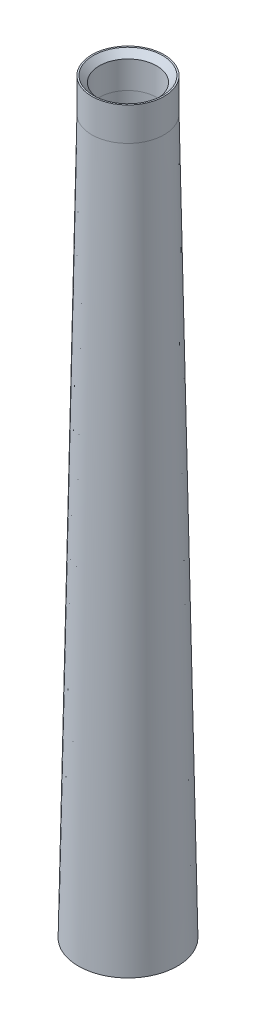
ISO-10303-21;
HEADER;
FILE_DESCRIPTION(('STEP AP214'),'2;1');
FILE_NAME('part.step','',(''),(''),'','','');
FILE_SCHEMA(('AUTOMOTIVE_DESIGN { 1 0 10303 214 1 1 1 1 }'));
ENDSEC;
DATA;
#1=APPLICATION_CONTEXT('core data for automotive mechanical design processes');
#2=APPLICATION_PROTOCOL_DEFINITION('international standard','automotive_design',2000,#1);
#3=PRODUCT_CONTEXT('',#1,'mechanical');
#4=PRODUCT('Part','Part','',(#3));
#5=PRODUCT_RELATED_PRODUCT_CATEGORY('part','',(#4));
#6=PRODUCT_DEFINITION_FORMATION('','',#4);
#7=PRODUCT_DEFINITION_CONTEXT('part definition',#1,'design');
#8=PRODUCT_DEFINITION('design','',#6,#7);
#9=PRODUCT_DEFINITION_SHAPE('','',#8);
#10=(LENGTH_UNIT() NAMED_UNIT(*) SI_UNIT(.MILLI.,.METRE.));
#11=(NAMED_UNIT(*) PLANE_ANGLE_UNIT() SI_UNIT($,.RADIAN.));
#12=(NAMED_UNIT(*) SI_UNIT($,.STERADIAN.) SOLID_ANGLE_UNIT());
#13=UNCERTAINTY_MEASURE_WITH_UNIT(LENGTH_MEASURE(1.E-05),#10,'distance_accuracy_value','');
#14=(GEOMETRIC_REPRESENTATION_CONTEXT(3) GLOBAL_UNCERTAINTY_ASSIGNED_CONTEXT((#13)) GLOBAL_UNIT_ASSIGNED_CONTEXT((#10,
#11,#12)) REPRESENTATION_CONTEXT('',''));
#15=CARTESIAN_POINT('',(0.,0.,0.));
#16=DIRECTION('',(0.,0.,1.));
#17=DIRECTION('',(1.,0.,0.));
#18=AXIS2_PLACEMENT_3D('',#15,#16,#17);
#19=CARTESIAN_POINT('',(0.,0.,0.));
#20=DIRECTION('',(0.,-1.,0.));
#21=DIRECTION('',(0.,0.,-1.));
#22=AXIS2_PLACEMENT_3D('',#19,#20,#21);
#23=PLANE('',#22);
#24=CARTESIAN_POINT('',(0.,0.,0.));
#25=DIRECTION('',(0.,1.,0.));
#26=DIRECTION('',(0.,0.,1.));
#27=AXIS2_PLACEMENT_3D('',#24,#25,#26);
#28=CIRCLE('',#27,8.98497221042653);
#29=CARTESIAN_POINT('',(0.,0.,8.98497221042653));
#30=VERTEX_POINT('',#29);
#31=EDGE_CURVE('E50',#30,#30,#28,.T.);
#32=ORIENTED_EDGE('',*,*,#31,.T.);
#33=EDGE_LOOP('',(#32));
#34=FACE_BOUND('',#33,.T.);
#35=CARTESIAN_POINT('',(0.,0.,0.));
#36=DIRECTION('',(0.,1.,0.));
#37=DIRECTION('',(0.,0.,1.));
#38=AXIS2_PLACEMENT_3D('',#35,#36,#37);
#39=CIRCLE('',#38,10.57275);
#40=CARTESIAN_POINT('',(0.,0.,10.57275));
#41=VERTEX_POINT('',#40);
#42=EDGE_CURVE('E41',#41,#41,#39,.T.);
#43=ORIENTED_EDGE('',*,*,#42,.F.);
#44=EDGE_LOOP('',(#43));
#45=FACE_BOUND('',#44,.T.);
#46=ADVANCED_FACE('F30',(#34,#45),#23,.T.);
#47=CARTESIAN_POINT('',(0.,152.4,0.));
#48=DIRECTION('',(0.,-1.,0.));
#49=DIRECTION('',(0.,0.,-1.));
#50=AXIS2_PLACEMENT_3D('',#47,#48,#49);
#51=CONICAL_SURFACE('',#50,7.72160000000001,0.0187061511418619);
#52=ORIENTED_EDGE('',*,*,#42,.T.);
#53=EDGE_LOOP('',(#52));
#54=FACE_BOUND('',#53,.T.);
#55=CARTESIAN_POINT('',(0.,152.4,0.));
#56=DIRECTION('',(0.,1.,0.));
#57=DIRECTION('',(0.,0.,1.));
#58=AXIS2_PLACEMENT_3D('',#55,#56,#57);
#59=CIRCLE('',#58,7.72160000000001);
#60=CARTESIAN_POINT('',(0.,152.4,7.7216));
#61=VERTEX_POINT('',#60);
#62=EDGE_CURVE('E45',#61,#61,#59,.T.);
#63=ORIENTED_EDGE('',*,*,#62,.F.);
#64=EDGE_LOOP('',(#63));
#65=FACE_BOUND('',#64,.T.);
#66=ADVANCED_FACE('F76',(#54,#65),#51,.T.);
#67=CARTESIAN_POINT('',(0.,152.4,0.));
#68=DIRECTION('',(0.,-1.,0.));
#69=DIRECTION('',(0.,0.,-1.));
#70=AXIS2_PLACEMENT_3D('',#67,#68,#69);
#71=CONICAL_SURFACE('',#70,6.13382221042654,0.0187061511418619);
#72=ORIENTED_EDGE('',*,*,#31,.F.);
#73=EDGE_LOOP('',(#72));
#74=FACE_BOUND('',#73,.T.);
#75=CARTESIAN_POINT('',(0.,152.4,0.));
#76=DIRECTION('',(0.,1.,0.));
#77=DIRECTION('',(0.,0.,1.));
#78=AXIS2_PLACEMENT_3D('',#75,#76,#77);
#79=CIRCLE('',#78,6.13382221042654);
#80=CARTESIAN_POINT('',(0.,152.4,6.13382221042653));
#81=VERTEX_POINT('',#80);
#82=EDGE_CURVE('E56',#81,#81,#79,.T.);
#83=ORIENTED_EDGE('',*,*,#82,.T.);
#84=EDGE_LOOP('',(#83));
#85=FACE_BOUND('',#84,.T.);
#86=ADVANCED_FACE('F60',(#74,#85),#71,.F.);
#87=CARTESIAN_POINT('',(0.,159.512,0.));
#88=DIRECTION('',(0.,1.,0.));
#89=DIRECTION('',(0.,0.,1.));
#90=AXIS2_PLACEMENT_3D('',#87,#88,#89);
#91=PLANE('',#90);
#92=CARTESIAN_POINT('',(0.,159.512,0.));
#93=DIRECTION('',(0.,1.,0.));
#94=DIRECTION('',(0.,0.,1.));
#95=AXIS2_PLACEMENT_3D('',#92,#93,#94);
#96=CIRCLE('',#95,7.40382221042658);
#97=CARTESIAN_POINT('',(0.,159.512,7.40382221042657));
#98=VERTEX_POINT('',#97);
#99=EDGE_CURVE('E10',#98,#98,#96,.F.);
#100=ORIENTED_EDGE('',*,*,#99,.T.);
#101=EDGE_LOOP('',(#100));
#102=FACE_BOUND('',#101,.T.);
#103=CARTESIAN_POINT('',(0.,159.512,0.));
#104=DIRECTION('',(0.,1.,0.));
#105=DIRECTION('',(0.,0.,1.));
#106=AXIS2_PLACEMENT_3D('',#103,#104,#105);
#107=CIRCLE('',#106,7.72160000000001);
#108=CARTESIAN_POINT('',(0.,159.512,7.7216));
#109=VERTEX_POINT('',#108);
#110=EDGE_CURVE('E53',#109,#109,#107,.T.);
#111=ORIENTED_EDGE('',*,*,#110,.T.);
#112=EDGE_LOOP('',(#111));
#113=FACE_BOUND('',#112,.T.);
#114=ADVANCED_FACE('F71',(#102,#113),#91,.T.);
#115=CARTESIAN_POINT('',(0.,159.512,0.));
#116=DIRECTION('',(0.,-1.,0.));
#117=DIRECTION('',(0.,0.,-1.));
#118=AXIS2_PLACEMENT_3D('',#115,#116,#117);
#119=CYLINDRICAL_SURFACE('',#118,7.72160000000001);
#120=ORIENTED_EDGE('',*,*,#110,.F.);
#121=EDGE_LOOP('',(#120));
#122=FACE_BOUND('',#121,.T.);
#123=ORIENTED_EDGE('',*,*,#62,.T.);
#124=EDGE_LOOP('',(#123));
#125=FACE_BOUND('',#124,.T.);
#126=ADVANCED_FACE('F64',(#122,#125),#119,.T.);
#127=CARTESIAN_POINT('',(0.,159.512,0.));
#128=DIRECTION('',(0.,-1.,0.));
#129=DIRECTION('',(0.,0.,-1.));
#130=AXIS2_PLACEMENT_3D('',#127,#128,#129);
#131=CYLINDRICAL_SURFACE('',#130,6.13382221042654);
#132=CARTESIAN_POINT('',(0.,158.242,0.));
#133=DIRECTION('',(0.,1.,0.));
#134=DIRECTION('',(0.,0.,1.));
#135=AXIS2_PLACEMENT_3D('',#132,#133,#134);
#136=CIRCLE('',#135,6.13382221042654);
#137=CARTESIAN_POINT('',(0.,158.242,6.13382221042653));
#138=VERTEX_POINT('',#137);
#139=EDGE_CURVE('E37',#138,#138,#136,.T.);
#140=ORIENTED_EDGE('',*,*,#139,.T.);
#141=EDGE_LOOP('',(#140));
#142=FACE_BOUND('',#141,.T.);
#143=ORIENTED_EDGE('',*,*,#82,.F.);
#144=EDGE_LOOP('',(#143));
#145=FACE_BOUND('',#144,.T.);
#146=ADVANCED_FACE('F62',(#142,#145),#131,.F.);
#147=CARTESIAN_POINT('',(0.,158.242,0.));
#148=DIRECTION('',(0.,1.,0.));
#149=DIRECTION('',(0.,0.,1.));
#150=AXIS2_PLACEMENT_3D('',#147,#148,#149);
#151=CONICAL_SURFACE('',#150,6.13382221042654,0.785398163397446);
#152=ORIENTED_EDGE('',*,*,#99,.F.);
#153=EDGE_LOOP('',(#152));
#154=FACE_BOUND('',#153,.T.);
#155=ORIENTED_EDGE('',*,*,#139,.F.);
#156=EDGE_LOOP('',(#155));
#157=FACE_BOUND('',#156,.T.);
#158=ADVANCED_FACE('F32',(#154,#157),#151,.F.);
#159=CLOSED_SHELL('',(#46,#66,#86,#114,#126,#146,#158));
#160=MANIFOLD_SOLID_BREP('B2',#159);
#161=ADVANCED_BREP_SHAPE_REPRESENTATION('',(#18,#160),#14);
#162=SHAPE_DEFINITION_REPRESENTATION(#9,#161);
ENDSEC;
END-ISO-10303-21;
